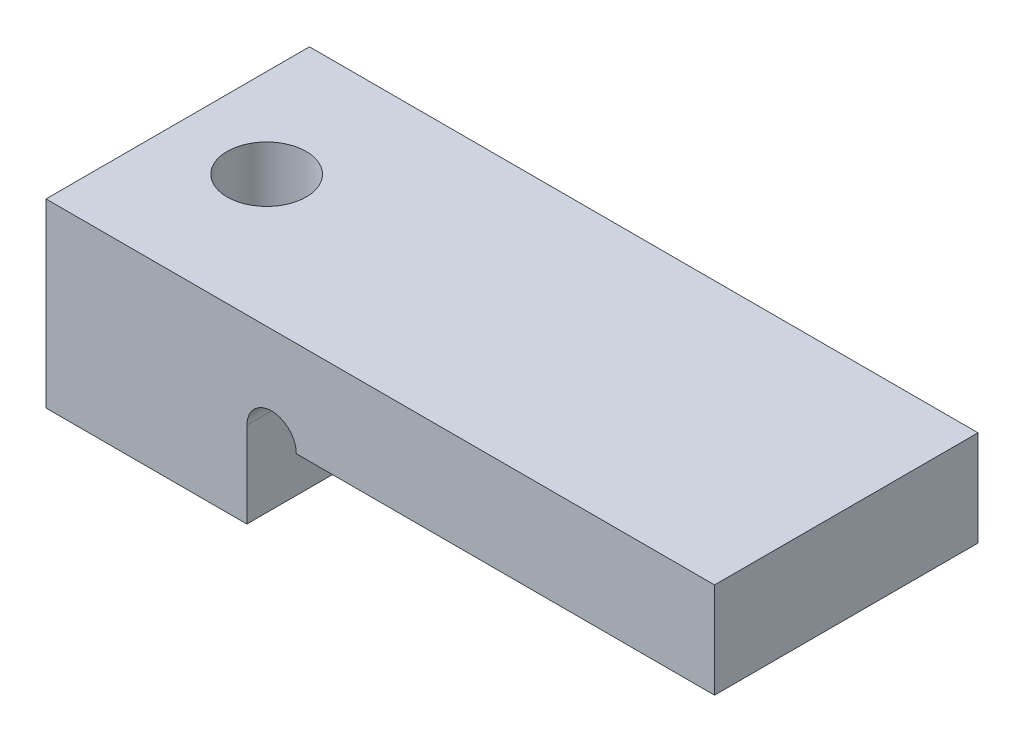
ISO-10303-21;
HEADER;
FILE_DESCRIPTION(('STEP AP214'),'2;1');
FILE_NAME('part.step','',(''),(''),'','','');
FILE_SCHEMA(('AUTOMOTIVE_DESIGN { 1 0 10303 214 1 1 1 1 }'));
ENDSEC;
DATA;
#1=APPLICATION_CONTEXT('core data for automotive mechanical design processes');
#2=APPLICATION_PROTOCOL_DEFINITION('international standard','automotive_design',2000,#1);
#3=PRODUCT_CONTEXT('',#1,'mechanical');
#4=PRODUCT('Part','Part','',(#3));
#5=PRODUCT_RELATED_PRODUCT_CATEGORY('part','',(#4));
#6=PRODUCT_DEFINITION_FORMATION('','',#4);
#7=PRODUCT_DEFINITION_CONTEXT('part definition',#1,'design');
#8=PRODUCT_DEFINITION('design','',#6,#7);
#9=PRODUCT_DEFINITION_SHAPE('','',#8);
#10=(LENGTH_UNIT() NAMED_UNIT(*) SI_UNIT(.MILLI.,.METRE.));
#11=(NAMED_UNIT(*) PLANE_ANGLE_UNIT() SI_UNIT($,.RADIAN.));
#12=(NAMED_UNIT(*) SI_UNIT($,.STERADIAN.) SOLID_ANGLE_UNIT());
#13=UNCERTAINTY_MEASURE_WITH_UNIT(LENGTH_MEASURE(1.E-05),#10,'distance_accuracy_value','');
#14=(GEOMETRIC_REPRESENTATION_CONTEXT(3) GLOBAL_UNCERTAINTY_ASSIGNED_CONTEXT((#13)) GLOBAL_UNIT_ASSIGNED_CONTEXT((#10,
#11,#12)) REPRESENTATION_CONTEXT('',''));
#15=CARTESIAN_POINT('',(0.,0.,0.));
#16=DIRECTION('',(0.,0.,1.));
#17=DIRECTION('',(1.,0.,0.));
#18=AXIS2_PLACEMENT_3D('',#15,#16,#17);
#19=CARTESIAN_POINT('',(20.3,5.5,4.));
#20=DIRECTION('',(-1.,0.,0.));
#21=DIRECTION('',(0.,0.,1.));
#22=AXIS2_PLACEMENT_3D('',#19,#20,#21);
#23=PLANE('',#22);
#24=DIRECTION('',(0.,1.,0.));
#25=VECTOR('',#24,1.);
#26=CARTESIAN_POINT('',(20.3,5.5,-4.));
#27=LINE('',#26,#25);
#28=CARTESIAN_POINT('',(20.3,2.6,-4.));
#29=VERTEX_POINT('',#28);
#30=CARTESIAN_POINT('',(20.3,5.5,-4.));
#31=VERTEX_POINT('',#30);
#32=EDGE_CURVE('E126',#29,#31,#27,.T.);
#33=ORIENTED_EDGE('',*,*,#32,.T.);
#34=DIRECTION('',(0.,0.,-1.));
#35=VECTOR('',#34,1.);
#36=CARTESIAN_POINT('',(20.3,5.5,4.));
#37=LINE('',#36,#35);
#38=CARTESIAN_POINT('',(20.3,5.5,4.));
#39=VERTEX_POINT('',#38);
#40=EDGE_CURVE('E11',#39,#31,#37,.T.);
#41=ORIENTED_EDGE('',*,*,#40,.F.);
#42=DIRECTION('',(0.,1.,0.));
#43=VECTOR('',#42,1.);
#44=CARTESIAN_POINT('',(20.3,5.5,4.));
#45=LINE('',#44,#43);
#46=CARTESIAN_POINT('',(20.3,2.6,4.));
#47=VERTEX_POINT('',#46);
#48=EDGE_CURVE('E138',#47,#39,#45,.T.);
#49=ORIENTED_EDGE('',*,*,#48,.F.);
#50=DIRECTION('',(0.,0.,-1.));
#51=VECTOR('',#50,1.);
#52=CARTESIAN_POINT('',(20.3,2.6,4.));
#53=LINE('',#52,#51);
#54=EDGE_CURVE('E125',#47,#29,#53,.T.);
#55=ORIENTED_EDGE('',*,*,#54,.T.);
#56=EDGE_LOOP('',(#33,#41,#49,#55));
#57=FACE_BOUND('',#56,.T.);
#58=ADVANCED_FACE('F34',(#57),#23,.F.);
#59=CARTESIAN_POINT('',(20.3,5.5,4.));
#60=DIRECTION('',(0.,-1.,0.));
#61=DIRECTION('',(1.,0.,0.));
#62=AXIS2_PLACEMENT_3D('',#59,#60,#61);
#63=PLANE('',#62);
#64=CARTESIAN_POINT('',(2.7,5.5,0.));
#65=DIRECTION('',(0.,1.,0.));
#66=DIRECTION('',(0.,0.,1.));
#67=AXIS2_PLACEMENT_3D('',#64,#65,#66);
#68=CIRCLE('',#67,1.2);
#69=CARTESIAN_POINT('',(2.7,5.5,1.2));
#70=VERTEX_POINT('',#69);
#71=EDGE_CURVE('E158',#70,#70,#68,.T.);
#72=ORIENTED_EDGE('',*,*,#71,.F.);
#73=EDGE_LOOP('',(#72));
#74=FACE_BOUND('',#73,.T.);
#75=DIRECTION('',(-1.,0.,0.));
#76=VECTOR('',#75,1.);
#77=CARTESIAN_POINT('',(20.3,5.5,-4.));
#78=LINE('',#77,#76);
#79=CARTESIAN_POINT('',(0.,5.5,-4.));
#80=VERTEX_POINT('',#79);
#81=EDGE_CURVE('E129',#31,#80,#78,.T.);
#82=ORIENTED_EDGE('',*,*,#81,.T.);
#83=DIRECTION('',(0.,0.,-1.));
#84=VECTOR('',#83,1.);
#85=CARTESIAN_POINT('',(0.,5.5,4.));
#86=LINE('',#85,#84);
#87=CARTESIAN_POINT('',(0.,5.5,4.));
#88=VERTEX_POINT('',#87);
#89=EDGE_CURVE('E43',#88,#80,#86,.T.);
#90=ORIENTED_EDGE('',*,*,#89,.F.);
#91=DIRECTION('',(-1.,0.,0.));
#92=VECTOR('',#91,1.);
#93=CARTESIAN_POINT('',(20.3,5.5,4.));
#94=LINE('',#93,#92);
#95=EDGE_CURVE('E91',#39,#88,#94,.T.);
#96=ORIENTED_EDGE('',*,*,#95,.F.);
#97=ORIENTED_EDGE('',*,*,#40,.T.);
#98=EDGE_LOOP('',(#82,#90,#96,#97));
#99=FACE_BOUND('',#98,.T.);
#100=ADVANCED_FACE('F184',(#74,#99),#63,.F.);
#101=CARTESIAN_POINT('',(0.,0.,4.));
#102=DIRECTION('',(1.,0.,0.));
#103=DIRECTION('',(0.,0.,-1.));
#104=AXIS2_PLACEMENT_3D('',#101,#102,#103);
#105=PLANE('',#104);
#106=DIRECTION('',(0.,-1.,0.));
#107=VECTOR('',#106,1.);
#108=CARTESIAN_POINT('',(0.,0.,-4.));
#109=LINE('',#108,#107);
#110=CARTESIAN_POINT('',(0.,0.,-4.));
#111=VERTEX_POINT('',#110);
#112=EDGE_CURVE('E111',#80,#111,#109,.T.);
#113=ORIENTED_EDGE('',*,*,#112,.T.);
#114=DIRECTION('',(0.,0.,-1.));
#115=VECTOR('',#114,1.);
#116=CARTESIAN_POINT('',(0.,0.,4.));
#117=LINE('',#116,#115);
#118=CARTESIAN_POINT('',(0.,0.,4.));
#119=VERTEX_POINT('',#118);
#120=EDGE_CURVE('E108',#119,#111,#117,.T.);
#121=ORIENTED_EDGE('',*,*,#120,.F.);
#122=DIRECTION('',(0.,-1.,0.));
#123=VECTOR('',#122,1.);
#124=CARTESIAN_POINT('',(0.,0.,4.));
#125=LINE('',#124,#123);
#126=EDGE_CURVE('E97',#88,#119,#125,.T.);
#127=ORIENTED_EDGE('',*,*,#126,.F.);
#128=ORIENTED_EDGE('',*,*,#89,.T.);
#129=EDGE_LOOP('',(#113,#121,#127,#128));
#130=FACE_BOUND('',#129,.T.);
#131=ADVANCED_FACE('F109',(#130),#105,.F.);
#132=CARTESIAN_POINT('',(0.,0.,4.));
#133=DIRECTION('',(0.,1.,0.));
#134=DIRECTION('',(-1.,0.,0.));
#135=AXIS2_PLACEMENT_3D('',#132,#133,#134);
#136=PLANE('',#135);
#137=CARTESIAN_POINT('',(2.7,0.,0.));
#138=DIRECTION('',(0.,1.,0.));
#139=DIRECTION('',(-1.,0.,0.));
#140=AXIS2_PLACEMENT_3D('',#137,#138,#139);
#141=CIRCLE('',#140,1.2);
#142=CARTESIAN_POINT('',(2.7,0.,1.2));
#143=VERTEX_POINT('',#142);
#144=EDGE_CURVE('E37',#143,#143,#141,.T.);
#145=ORIENTED_EDGE('',*,*,#144,.T.);
#146=EDGE_LOOP('',(#145));
#147=FACE_BOUND('',#146,.T.);
#148=DIRECTION('',(1.,0.,0.));
#149=VECTOR('',#148,1.);
#150=CARTESIAN_POINT('',(0.,0.,-4.));
#151=LINE('',#150,#149);
#152=CARTESIAN_POINT('',(6.1,0.,-4.));
#153=VERTEX_POINT('',#152);
#154=EDGE_CURVE('E132',#111,#153,#151,.T.);
#155=ORIENTED_EDGE('',*,*,#154,.T.);
#156=DIRECTION('',(0.,0.,-1.));
#157=VECTOR('',#156,1.);
#158=CARTESIAN_POINT('',(6.1,0.,4.));
#159=LINE('',#158,#157);
#160=CARTESIAN_POINT('',(6.1,0.,4.));
#161=VERTEX_POINT('',#160);
#162=EDGE_CURVE('E114',#161,#153,#159,.T.);
#163=ORIENTED_EDGE('',*,*,#162,.F.);
#164=DIRECTION('',(1.,0.,0.));
#165=VECTOR('',#164,1.);
#166=CARTESIAN_POINT('',(0.,0.,4.));
#167=LINE('',#166,#165);
#168=EDGE_CURVE('E102',#119,#161,#167,.T.);
#169=ORIENTED_EDGE('',*,*,#168,.F.);
#170=ORIENTED_EDGE('',*,*,#120,.T.);
#171=EDGE_LOOP('',(#155,#163,#169,#170));
#172=FACE_BOUND('',#171,.T.);
#173=ADVANCED_FACE('F116',(#147,#172),#136,.F.);
#174=CARTESIAN_POINT('',(6.1,2.6,4.));
#175=DIRECTION('',(-1.,0.,0.));
#176=DIRECTION('',(0.,-1.,0.));
#177=AXIS2_PLACEMENT_3D('',#174,#175,#176);
#178=PLANE('',#177);
#179=DIRECTION('',(0.,1.,0.));
#180=VECTOR('',#179,1.);
#181=CARTESIAN_POINT('',(6.1,2.6,-4.));
#182=LINE('',#181,#180);
#183=CARTESIAN_POINT('',(6.1,2.6,-4.));
#184=VERTEX_POINT('',#183);
#185=EDGE_CURVE('E134',#153,#184,#182,.T.);
#186=ORIENTED_EDGE('',*,*,#185,.T.);
#187=DIRECTION('',(0.,0.,-1.));
#188=VECTOR('',#187,1.);
#189=CARTESIAN_POINT('',(6.1,2.6,4.));
#190=LINE('',#189,#188);
#191=CARTESIAN_POINT('',(6.1,2.6,4.));
#192=VERTEX_POINT('',#191);
#193=EDGE_CURVE('E76',#192,#184,#190,.T.);
#194=ORIENTED_EDGE('',*,*,#193,.F.);
#195=DIRECTION('',(0.,1.,0.));
#196=VECTOR('',#195,1.);
#197=CARTESIAN_POINT('',(6.1,2.6,4.));
#198=LINE('',#197,#196);
#199=EDGE_CURVE('E119',#161,#192,#198,.T.);
#200=ORIENTED_EDGE('',*,*,#199,.F.);
#201=ORIENTED_EDGE('',*,*,#162,.T.);
#202=EDGE_LOOP('',(#186,#194,#200,#201));
#203=FACE_BOUND('',#202,.T.);
#204=ADVANCED_FACE('F147',(#203),#178,.F.);
#205=CARTESIAN_POINT('',(6.1,2.6,4.));
#206=DIRECTION('',(0.,1.,0.));
#207=DIRECTION('',(-1.,0.,0.));
#208=AXIS2_PLACEMENT_3D('',#205,#206,#207);
#209=PLANE('',#208);
#210=DIRECTION('',(1.,0.,0.));
#211=VECTOR('',#210,1.);
#212=CARTESIAN_POINT('',(6.1,2.6,4.));
#213=LINE('',#212,#211);
#214=CARTESIAN_POINT('',(7.6,2.6,4.));
#215=VERTEX_POINT('',#214);
#216=EDGE_CURVE('E51',#215,#47,#213,.T.);
#217=ORIENTED_EDGE('',*,*,#216,.F.);
#218=DIRECTION('',(0.,0.,1.));
#219=VECTOR('',#218,1.);
#220=CARTESIAN_POINT('',(7.6,2.6,-4.));
#221=LINE('',#220,#219);
#222=CARTESIAN_POINT('',(7.6,2.6,-4.));
#223=VERTEX_POINT('',#222);
#224=EDGE_CURVE('E152',#215,#223,#221,.F.);
#225=ORIENTED_EDGE('',*,*,#224,.T.);
#226=DIRECTION('',(1.,0.,0.));
#227=VECTOR('',#226,1.);
#228=CARTESIAN_POINT('',(6.1,2.6,-4.));
#229=LINE('',#228,#227);
#230=EDGE_CURVE('E83',#223,#29,#229,.T.);
#231=ORIENTED_EDGE('',*,*,#230,.T.);
#232=ORIENTED_EDGE('',*,*,#54,.F.);
#233=EDGE_LOOP('',(#217,#225,#231,#232));
#234=FACE_BOUND('',#233,.T.);
#235=ADVANCED_FACE('F157',(#234),#209,.F.);
#236=CARTESIAN_POINT('',(0.,0.,4.));
#237=DIRECTION('',(0.,0.,1.));
#238=DIRECTION('',(1.,0.,0.));
#239=AXIS2_PLACEMENT_3D('',#236,#237,#238);
#240=PLANE('',#239);
#241=CARTESIAN_POINT('',(6.85,2.6,4.));
#242=DIRECTION('',(0.,0.,1.));
#243=DIRECTION('',(1.,0.,0.));
#244=AXIS2_PLACEMENT_3D('',#241,#242,#243);
#245=CIRCLE('',#244,0.75);
#246=EDGE_CURVE('E149',#215,#192,#245,.T.);
#247=ORIENTED_EDGE('',*,*,#246,.F.);
#248=ORIENTED_EDGE('',*,*,#216,.T.);
#249=ORIENTED_EDGE('',*,*,#48,.T.);
#250=ORIENTED_EDGE('',*,*,#95,.T.);
#251=ORIENTED_EDGE('',*,*,#126,.T.);
#252=ORIENTED_EDGE('',*,*,#168,.T.);
#253=ORIENTED_EDGE('',*,*,#199,.T.);
#254=EDGE_LOOP('',(#247,#248,#249,#250,#251,#252,#253));
#255=FACE_BOUND('',#254,.T.);
#256=ADVANCED_FACE('F99',(#255),#240,.T.);
#257=CARTESIAN_POINT('',(0.,0.,-4.));
#258=DIRECTION('',(0.,0.,1.));
#259=DIRECTION('',(1.,0.,0.));
#260=AXIS2_PLACEMENT_3D('',#257,#258,#259);
#261=PLANE('',#260);
#262=ORIENTED_EDGE('',*,*,#230,.F.);
#263=CARTESIAN_POINT('',(6.85,2.6,-4.));
#264=DIRECTION('',(0.,0.,1.));
#265=DIRECTION('',(1.,0.,0.));
#266=AXIS2_PLACEMENT_3D('',#263,#264,#265);
#267=CIRCLE('',#266,0.75);
#268=EDGE_CURVE('E154',#223,#184,#267,.T.);
#269=ORIENTED_EDGE('',*,*,#268,.T.);
#270=ORIENTED_EDGE('',*,*,#185,.F.);
#271=ORIENTED_EDGE('',*,*,#154,.F.);
#272=ORIENTED_EDGE('',*,*,#112,.F.);
#273=ORIENTED_EDGE('',*,*,#81,.F.);
#274=ORIENTED_EDGE('',*,*,#32,.F.);
#275=EDGE_LOOP('',(#262,#269,#270,#271,#272,#273,#274));
#276=FACE_BOUND('',#275,.T.);
#277=ADVANCED_FACE('F143',(#276),#261,.F.);
#278=CARTESIAN_POINT('',(2.7,-1.2E-05,0.));
#279=DIRECTION('',(0.,1.,0.));
#280=DIRECTION('',(0.,0.,1.));
#281=AXIS2_PLACEMENT_3D('',#278,#279,#280);
#282=CYLINDRICAL_SURFACE('',#281,1.2);
#283=CARTESIAN_POINT('',(2.7,5.5,1.2));
#284=CARTESIAN_POINT('',(2.7,5.44270833333333,1.2));
#285=CARTESIAN_POINT('',(2.7,5.38541666666667,1.2));
#286=CARTESIAN_POINT('',(2.7,5.27083333333333,1.2));
#287=CARTESIAN_POINT('',(2.7,5.21354166666667,1.2));
#288=CARTESIAN_POINT('',(2.7,5.09895833333333,1.2));
#289=CARTESIAN_POINT('',(2.7,5.04166666666667,1.2));
#290=CARTESIAN_POINT('',(2.7,4.92708333333333,1.2));
#291=CARTESIAN_POINT('',(2.7,4.86979166666667,1.2));
#292=CARTESIAN_POINT('',(2.7,4.75520833333333,1.2));
#293=CARTESIAN_POINT('',(2.7,4.69791666666667,1.2));
#294=CARTESIAN_POINT('',(2.7,4.58333333333333,1.2));
#295=CARTESIAN_POINT('',(2.7,4.52604166666667,1.2));
#296=CARTESIAN_POINT('',(2.7,4.41145833333333,1.2));
#297=CARTESIAN_POINT('',(2.7,4.35416666666667,1.2));
#298=CARTESIAN_POINT('',(2.7,4.23958333333333,1.2));
#299=CARTESIAN_POINT('',(2.7,4.18229166666667,1.2));
#300=CARTESIAN_POINT('',(2.7,4.06770833333333,1.2));
#301=CARTESIAN_POINT('',(2.7,4.01041666666667,1.2));
#302=CARTESIAN_POINT('',(2.7,3.89583333333333,1.2));
#303=CARTESIAN_POINT('',(2.7,3.83854166666667,1.2));
#304=CARTESIAN_POINT('',(2.7,3.72395833333333,1.2));
#305=CARTESIAN_POINT('',(2.7,3.66666666666667,1.2));
#306=CARTESIAN_POINT('',(2.7,3.55208333333333,1.2));
#307=CARTESIAN_POINT('',(2.7,3.49479166666667,1.2));
#308=CARTESIAN_POINT('',(2.7,3.38020833333333,1.2));
#309=CARTESIAN_POINT('',(2.7,3.32291666666667,1.2));
#310=CARTESIAN_POINT('',(2.7,3.20833333333333,1.2));
#311=CARTESIAN_POINT('',(2.7,3.15104166666667,1.2));
#312=CARTESIAN_POINT('',(2.7,3.03645833333333,1.2));
#313=CARTESIAN_POINT('',(2.7,2.97916666666667,1.2));
#314=CARTESIAN_POINT('',(2.7,2.86458333333333,1.2));
#315=CARTESIAN_POINT('',(2.7,2.80729166666667,1.2));
#316=CARTESIAN_POINT('',(2.7,2.69270833333333,1.2));
#317=CARTESIAN_POINT('',(2.7,2.63541666666667,1.2));
#318=CARTESIAN_POINT('',(2.7,2.52083333333333,1.2));
#319=CARTESIAN_POINT('',(2.7,2.46354166666667,1.2));
#320=CARTESIAN_POINT('',(2.7,2.34895833333333,1.2));
#321=CARTESIAN_POINT('',(2.7,2.29166666666667,1.2));
#322=CARTESIAN_POINT('',(2.7,2.17708333333333,1.2));
#323=CARTESIAN_POINT('',(2.7,2.11979166666667,1.2));
#324=CARTESIAN_POINT('',(2.7,2.00520833333333,1.2));
#325=CARTESIAN_POINT('',(2.7,1.94791666666667,1.2));
#326=CARTESIAN_POINT('',(2.7,1.83333333333333,1.2));
#327=CARTESIAN_POINT('',(2.7,1.77604166666667,1.2));
#328=CARTESIAN_POINT('',(2.7,1.66145833333333,1.2));
#329=CARTESIAN_POINT('',(2.7,1.60416666666667,1.2));
#330=CARTESIAN_POINT('',(2.7,1.48958333333333,1.2));
#331=CARTESIAN_POINT('',(2.7,1.43229166666667,1.2));
#332=CARTESIAN_POINT('',(2.7,1.31770833333333,1.2));
#333=CARTESIAN_POINT('',(2.7,1.26041666666667,1.2));
#334=CARTESIAN_POINT('',(2.7,1.14583333333333,1.2));
#335=CARTESIAN_POINT('',(2.7,1.08854166666667,1.2));
#336=CARTESIAN_POINT('',(2.7,0.973958333333334,1.2));
#337=CARTESIAN_POINT('',(2.7,0.916666666666667,1.2));
#338=CARTESIAN_POINT('',(2.7,0.802083333333334,1.2));
#339=CARTESIAN_POINT('',(2.7,0.744791666666667,1.2));
#340=CARTESIAN_POINT('',(2.7,0.630208333333333,1.2));
#341=CARTESIAN_POINT('',(2.7,0.572916666666667,1.2));
#342=CARTESIAN_POINT('',(2.7,0.458333333333334,1.2));
#343=CARTESIAN_POINT('',(2.7,0.401041666666667,1.2));
#344=CARTESIAN_POINT('',(2.7,0.286458333333334,1.2));
#345=CARTESIAN_POINT('',(2.7,0.229166666666667,1.2));
#346=CARTESIAN_POINT('',(2.7,0.114583333333334,1.2));
#347=CARTESIAN_POINT('',(2.7,0.0572916666666675,1.2));
#348=CARTESIAN_POINT('',(2.7,0.,1.2));
#349=B_SPLINE_CURVE_WITH_KNOTS('',3,(#283,#284,#285,#286,#287,#288,#289,#290,#291,#292,#293,
#294,#295,#296,#297,#298,#299,#300,#301,#302,#303,#304,#305,#306,#307,#308,#309,#310,#311,#312,
#313,#314,#315,#316,#317,#318,#319,#320,#321,#322,#323,#324,#325,#326,#327,#328,#329,#330,#331,
#332,#333,#334,#335,#336,#337,#338,#339,#340,#341,#342,#343,#344,#345,#346,#347,#348),
.UNSPECIFIED.,.F.,.F.,(4,2,2,2,2,2,2,2,2,2,2,2,2,2,2,2,2,2,2,2,2,2,2,2,2,2,2,2,2,2,2,2,4),(0.,
0.171875,0.34375,0.515625,0.6875,0.859375,1.03125,1.203125,1.375,1.546875,1.71875,1.890625,
2.0625,2.234375,2.40625,2.578125,2.75,2.921875,3.09375,3.265625,3.4375,3.609375,3.78125,
3.953125,4.125,4.296875,4.46875,4.640625,4.8125,4.984375,5.15625,5.328125,5.5),.UNSPECIFIED.);
#350=EDGE_CURVE('BSEAM173',#70,#143,#349,.T.);
#351=ORIENTED_EDGE('',*,*,#71,.T.);
#352=ORIENTED_EDGE('',*,*,#144,.F.);
#353=ORIENTED_EDGE('',*,*,#350,.T.);
#354=ORIENTED_EDGE('',*,*,#350,.F.);
#355=EDGE_LOOP('',(#351,#353,#352,#354));
#356=FACE_BOUND('',#355,.T.);
#357=ADVANCED_FACE('F173',(#356),#282,.F.);
#358=CARTESIAN_POINT('',(6.85,2.6,-4.));
#359=DIRECTION('',(0.,0.,1.));
#360=DIRECTION('',(1.,0.,0.));
#361=AXIS2_PLACEMENT_3D('',#358,#359,#360);
#362=CYLINDRICAL_SURFACE('',#361,0.75);
#363=ORIENTED_EDGE('',*,*,#268,.F.);
#364=ORIENTED_EDGE('',*,*,#224,.F.);
#365=ORIENTED_EDGE('',*,*,#246,.T.);
#366=ORIENTED_EDGE('',*,*,#193,.T.);
#367=EDGE_LOOP('',(#363,#364,#365,#366));
#368=FACE_BOUND('',#367,.T.);
#369=ADVANCED_FACE('F155',(#368),#362,.F.);
#370=CLOSED_SHELL('',(#58,#100,#131,#173,#204,#235,#256,#277,#357,#369));
#371=MANIFOLD_SOLID_BREP('B2',#370);
#372=ADVANCED_BREP_SHAPE_REPRESENTATION('',(#18,#371),#14);
#373=SHAPE_DEFINITION_REPRESENTATION(#9,#372);
ENDSEC;
END-ISO-10303-21;
